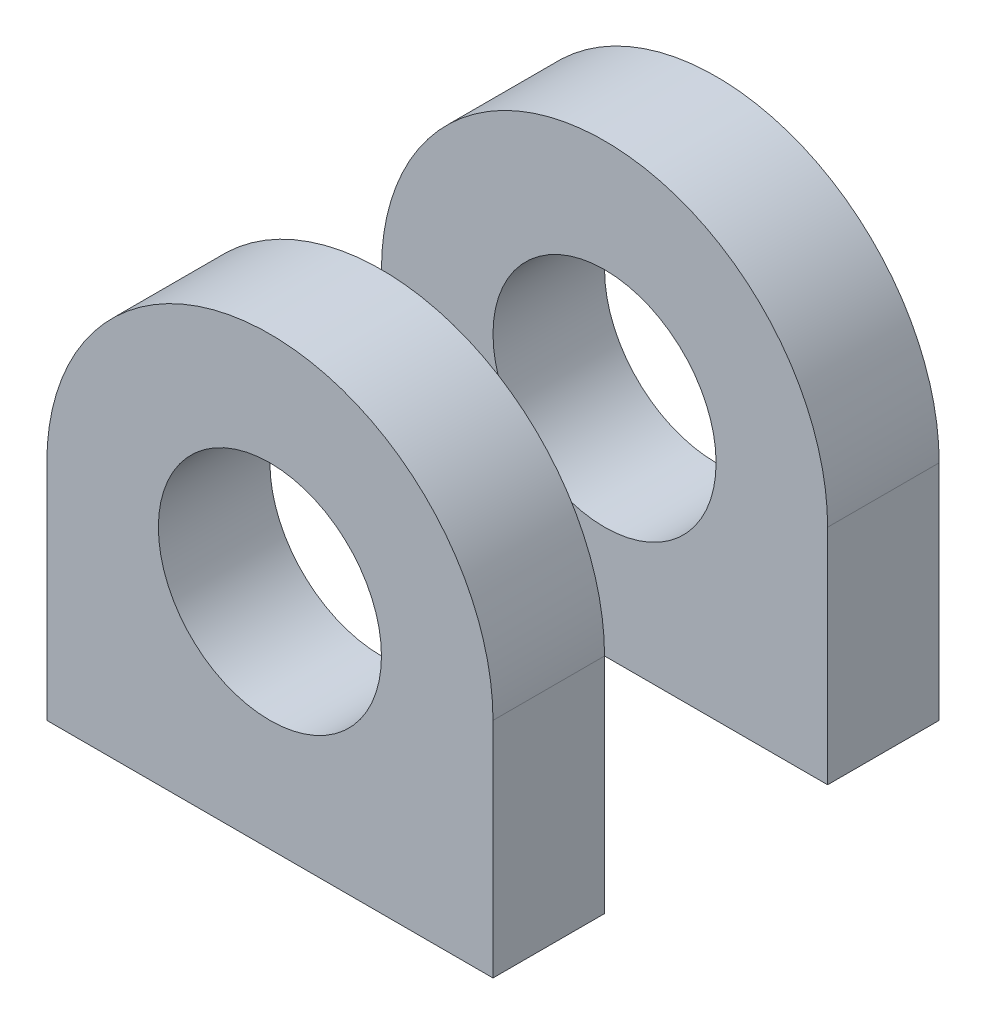
ISO-10303-21;
HEADER;
FILE_DESCRIPTION(('STEP AP214'),'2;1');
FILE_NAME('part.step','',(''),(''),'','','');
FILE_SCHEMA(('AUTOMOTIVE_DESIGN { 1 0 10303 214 1 1 1 1 }'));
ENDSEC;
DATA;
#1=APPLICATION_CONTEXT('core data for automotive mechanical design processes');
#2=APPLICATION_PROTOCOL_DEFINITION('international standard','automotive_design',2000,#1);
#3=PRODUCT_CONTEXT('',#1,'mechanical');
#4=PRODUCT('Part','Part','',(#3));
#5=PRODUCT_RELATED_PRODUCT_CATEGORY('part','',(#4));
#6=PRODUCT_DEFINITION_FORMATION('','',#4);
#7=PRODUCT_DEFINITION_CONTEXT('part definition',#1,'design');
#8=PRODUCT_DEFINITION('design','',#6,#7);
#9=PRODUCT_DEFINITION_SHAPE('','',#8);
#10=(LENGTH_UNIT() NAMED_UNIT(*) SI_UNIT(.MILLI.,.METRE.));
#11=(NAMED_UNIT(*) PLANE_ANGLE_UNIT() SI_UNIT($,.RADIAN.));
#12=(NAMED_UNIT(*) SI_UNIT($,.STERADIAN.) SOLID_ANGLE_UNIT());
#13=UNCERTAINTY_MEASURE_WITH_UNIT(LENGTH_MEASURE(1.E-05),#10,'distance_accuracy_value','');
#14=(GEOMETRIC_REPRESENTATION_CONTEXT(3) GLOBAL_UNCERTAINTY_ASSIGNED_CONTEXT((#13)) GLOBAL_UNIT_ASSIGNED_CONTEXT((#10,
#11,#12)) REPRESENTATION_CONTEXT('',''));
#15=CARTESIAN_POINT('',(0.,0.,0.));
#16=DIRECTION('',(0.,0.,1.));
#17=DIRECTION('',(1.,0.,0.));
#18=AXIS2_PLACEMENT_3D('',#15,#16,#17);
#19=CARTESIAN_POINT('',(100.,100.,100.));
#20=DIRECTION('',(-1.,0.,0.));
#21=DIRECTION('',(0.,0.,1.));
#22=AXIS2_PLACEMENT_3D('',#19,#20,#21);
#23=PLANE('',#22);
#24=DIRECTION('',(0.,0.,-1.));
#25=VECTOR('',#24,1.);
#26=CARTESIAN_POINT('',(100.,0.,100.));
#27=LINE('',#26,#25);
#28=CARTESIAN_POINT('',(100.,0.,100.));
#29=VERTEX_POINT('',#28);
#30=CARTESIAN_POINT('',(100.,0.,50.));
#31=VERTEX_POINT('',#30);
#32=EDGE_CURVE('E113',#29,#31,#27,.T.);
#33=ORIENTED_EDGE('',*,*,#32,.T.);
#34=DIRECTION('',(0.,-1.,0.));
#35=VECTOR('',#34,1.);
#36=CARTESIAN_POINT('',(100.,0.,50.));
#37=LINE('',#36,#35);
#38=CARTESIAN_POINT('',(100.,100.,50.));
#39=VERTEX_POINT('',#38);
#40=EDGE_CURVE('E12',#39,#31,#37,.T.);
#41=ORIENTED_EDGE('',*,*,#40,.F.);
#42=DIRECTION('',(0.,0.,-1.));
#43=VECTOR('',#42,1.);
#44=CARTESIAN_POINT('',(100.,100.,100.));
#45=LINE('',#44,#43);
#46=CARTESIAN_POINT('',(100.,100.,100.));
#47=VERTEX_POINT('',#46);
#48=EDGE_CURVE('E109',#47,#39,#45,.T.);
#49=ORIENTED_EDGE('',*,*,#48,.F.);
#50=DIRECTION('',(0.,-1.,0.));
#51=VECTOR('',#50,1.);
#52=CARTESIAN_POINT('',(100.,100.,100.));
#53=LINE('',#52,#51);
#54=EDGE_CURVE('E79',#47,#29,#53,.T.);
#55=ORIENTED_EDGE('',*,*,#54,.T.);
#56=EDGE_LOOP('',(#33,#41,#49,#55));
#57=FACE_BOUND('',#56,.T.);
#58=ADVANCED_FACE('F44',(#57),#23,.F.);
#59=CARTESIAN_POINT('',(-100.,100.,100.));
#60=DIRECTION('',(1.,0.,0.));
#61=DIRECTION('',(0.,0.,-1.));
#62=AXIS2_PLACEMENT_3D('',#59,#60,#61);
#63=PLANE('',#62);
#64=DIRECTION('',(0.,0.,1.));
#65=VECTOR('',#64,1.);
#66=CARTESIAN_POINT('',(-100.,100.,100.));
#67=LINE('',#66,#65);
#68=CARTESIAN_POINT('',(-100.,100.,50.));
#69=VERTEX_POINT('',#68);
#70=CARTESIAN_POINT('',(-100.,100.,100.));
#71=VERTEX_POINT('',#70);
#72=EDGE_CURVE('E94',#69,#71,#67,.T.);
#73=ORIENTED_EDGE('',*,*,#72,.F.);
#74=DIRECTION('',(0.,-1.,0.));
#75=VECTOR('',#74,1.);
#76=CARTESIAN_POINT('',(-100.,0.,50.));
#77=LINE('',#76,#75);
#78=CARTESIAN_POINT('',(-100.,0.,50.));
#79=VERTEX_POINT('',#78);
#80=EDGE_CURVE('E110',#69,#79,#77,.T.);
#81=ORIENTED_EDGE('',*,*,#80,.T.);
#82=DIRECTION('',(0.,0.,1.));
#83=VECTOR('',#82,1.);
#84=CARTESIAN_POINT('',(-100.,0.,100.));
#85=LINE('',#84,#83);
#86=CARTESIAN_POINT('',(-100.,0.,100.));
#87=VERTEX_POINT('',#86);
#88=EDGE_CURVE('E88',#79,#87,#85,.T.);
#89=ORIENTED_EDGE('',*,*,#88,.T.);
#90=DIRECTION('',(0.,-1.,0.));
#91=VECTOR('',#90,1.);
#92=CARTESIAN_POINT('',(-100.,100.,100.));
#93=LINE('',#92,#91);
#94=EDGE_CURVE('E53',#71,#87,#93,.T.);
#95=ORIENTED_EDGE('',*,*,#94,.F.);
#96=EDGE_LOOP('',(#73,#81,#89,#95));
#97=FACE_BOUND('',#96,.T.);
#98=ADVANCED_FACE('F100',(#97),#63,.F.);
#99=CARTESIAN_POINT('',(0.,0.,0.));
#100=DIRECTION('',(0.,-1.,0.));
#101=DIRECTION('',(0.,0.,-1.));
#102=AXIS2_PLACEMENT_3D('',#99,#100,#101);
#103=PLANE('',#102);
#104=DIRECTION('',(1.,0.,0.));
#105=VECTOR('',#104,1.);
#106=CARTESIAN_POINT('',(-100.,0.,50.));
#107=LINE('',#106,#105);
#108=EDGE_CURVE('E70',#79,#31,#107,.T.);
#109=ORIENTED_EDGE('',*,*,#108,.T.);
#110=ORIENTED_EDGE('',*,*,#32,.F.);
#111=DIRECTION('',(1.,0.,0.));
#112=VECTOR('',#111,1.);
#113=CARTESIAN_POINT('',(-100.,0.,100.));
#114=LINE('',#113,#112);
#115=EDGE_CURVE('E98',#87,#29,#114,.T.);
#116=ORIENTED_EDGE('',*,*,#115,.F.);
#117=ORIENTED_EDGE('',*,*,#88,.F.);
#118=EDGE_LOOP('',(#109,#110,#116,#117));
#119=FACE_BOUND('',#118,.T.);
#120=ADVANCED_FACE('F141',(#119),#103,.T.);
#121=CARTESIAN_POINT('',(0.,100.,100.));
#122=DIRECTION('',(0.,0.,-1.));
#123=DIRECTION('',(-1.,0.,0.));
#124=AXIS2_PLACEMENT_3D('',#121,#122,#123);
#125=CYLINDRICAL_SURFACE('',#124,100.);
#126=ORIENTED_EDGE('',*,*,#48,.T.);
#127=CARTESIAN_POINT('',(0.,100.,50.));
#128=DIRECTION('',(0.,0.,1.));
#129=DIRECTION('',(1.,0.,0.));
#130=AXIS2_PLACEMENT_3D('',#127,#128,#129);
#131=CIRCLE('',#130,100.);
#132=EDGE_CURVE('E61',#39,#69,#131,.T.);
#133=ORIENTED_EDGE('',*,*,#132,.T.);
#134=ORIENTED_EDGE('',*,*,#72,.T.);
#135=CARTESIAN_POINT('',(0.,100.,100.));
#136=DIRECTION('',(0.,0.,1.));
#137=DIRECTION('',(1.,0.,0.));
#138=AXIS2_PLACEMENT_3D('',#135,#136,#137);
#139=CIRCLE('',#138,100.);
#140=EDGE_CURVE('E97',#47,#71,#139,.T.);
#141=ORIENTED_EDGE('',*,*,#140,.F.);
#142=EDGE_LOOP('',(#126,#133,#134,#141));
#143=FACE_BOUND('',#142,.T.);
#144=ADVANCED_FACE('F96',(#143),#125,.T.);
#145=CARTESIAN_POINT('',(-100.,100.,100.));
#146=DIRECTION('',(0.,0.,-1.));
#147=DIRECTION('',(-1.,0.,0.));
#148=AXIS2_PLACEMENT_3D('',#145,#146,#147);
#149=PLANE('',#148);
#150=CARTESIAN_POINT('',(0.,100.,100.));
#151=DIRECTION('',(0.,0.,-1.));
#152=DIRECTION('',(-1.,0.,0.));
#153=AXIS2_PLACEMENT_3D('',#150,#151,#152);
#154=CIRCLE('',#153,50.);
#155=CARTESIAN_POINT('',(-50.,100.,100.));
#156=VERTEX_POINT('',#155);
#157=EDGE_CURVE('E118',#156,#156,#154,.T.);
#158=ORIENTED_EDGE('',*,*,#157,.T.);
#159=EDGE_LOOP('',(#158));
#160=FACE_BOUND('',#159,.T.);
#161=ORIENTED_EDGE('',*,*,#115,.T.);
#162=ORIENTED_EDGE('',*,*,#54,.F.);
#163=ORIENTED_EDGE('',*,*,#140,.T.);
#164=ORIENTED_EDGE('',*,*,#94,.T.);
#165=EDGE_LOOP('',(#161,#162,#163,#164));
#166=FACE_BOUND('',#165,.T.);
#167=ADVANCED_FACE('F103',(#160,#166),#149,.F.);
#168=CARTESIAN_POINT('',(-100.,0.,50.));
#169=DIRECTION('',(0.,0.,1.));
#170=DIRECTION('',(1.,0.,0.));
#171=AXIS2_PLACEMENT_3D('',#168,#169,#170);
#172=PLANE('',#171);
#173=CARTESIAN_POINT('',(0.,100.,50.));
#174=DIRECTION('',(0.,0.,1.));
#175=DIRECTION('',(1.,0.,0.));
#176=AXIS2_PLACEMENT_3D('',#173,#174,#175);
#177=CIRCLE('',#176,50.);
#178=CARTESIAN_POINT('',(50.,100.,50.));
#179=VERTEX_POINT('',#178);
#180=EDGE_CURVE('E47',#179,#179,#177,.T.);
#181=ORIENTED_EDGE('',*,*,#180,.T.);
#182=EDGE_LOOP('',(#181));
#183=FACE_BOUND('',#182,.T.);
#184=ORIENTED_EDGE('',*,*,#40,.T.);
#185=ORIENTED_EDGE('',*,*,#108,.F.);
#186=ORIENTED_EDGE('',*,*,#80,.F.);
#187=ORIENTED_EDGE('',*,*,#132,.F.);
#188=EDGE_LOOP('',(#184,#185,#186,#187));
#189=FACE_BOUND('',#188,.T.);
#190=ADVANCED_FACE('F130',(#183,#189),#172,.F.);
#191=CARTESIAN_POINT('',(0.,100.,100.));
#192=DIRECTION('',(0.,0.,-1.));
#193=DIRECTION('',(-1.,0.,0.));
#194=AXIS2_PLACEMENT_3D('',#191,#192,#193);
#195=CYLINDRICAL_SURFACE('',#194,50.);
#196=ORIENTED_EDGE('',*,*,#157,.F.);
#197=EDGE_LOOP('',(#196));
#198=FACE_BOUND('',#197,.T.);
#199=ORIENTED_EDGE('',*,*,#180,.F.);
#200=EDGE_LOOP('',(#199));
#201=FACE_BOUND('',#200,.T.);
#202=ADVANCED_FACE('F127',(#198,#201),#195,.F.);
#203=CLOSED_SHELL('',(#58,#98,#120,#144,#167,#190,#202));
#204=MANIFOLD_SOLID_BREP('B2',#203);
#205=CARTESIAN_POINT('',(-100.,100.,-100.));
#206=DIRECTION('',(0.,0.,1.));
#207=DIRECTION('',(1.,0.,0.));
#208=AXIS2_PLACEMENT_3D('',#205,#206,#207);
#209=PLANE('',#208);
#210=CARTESIAN_POINT('',(0.,100.,-100.));
#211=DIRECTION('',(0.,0.,1.));
#212=DIRECTION('',(1.,0.,0.));
#213=AXIS2_PLACEMENT_3D('',#210,#211,#212);
#214=CIRCLE('',#213,50.);
#215=CARTESIAN_POINT('',(50.,100.,-100.));
#216=VERTEX_POINT('',#215);
#217=EDGE_CURVE('E249',#216,#216,#214,.T.);
#218=ORIENTED_EDGE('',*,*,#217,.T.);
#219=EDGE_LOOP('',(#218));
#220=FACE_BOUND('',#219,.T.);
#221=DIRECTION('',(-1.,0.,0.));
#222=VECTOR('',#221,1.);
#223=CARTESIAN_POINT('',(-100.,0.,-100.));
#224=LINE('',#223,#222);
#225=CARTESIAN_POINT('',(100.,0.,-100.));
#226=VERTEX_POINT('',#225);
#227=CARTESIAN_POINT('',(-100.,0.,-100.));
#228=VERTEX_POINT('',#227);
#229=EDGE_CURVE('E252',#226,#228,#224,.T.);
#230=ORIENTED_EDGE('',*,*,#229,.T.);
#231=DIRECTION('',(0.,-1.,0.));
#232=VECTOR('',#231,1.);
#233=CARTESIAN_POINT('',(-100.,100.,-100.));
#234=LINE('',#233,#232);
#235=CARTESIAN_POINT('',(-100.,100.,-100.));
#236=VERTEX_POINT('',#235);
#237=EDGE_CURVE('E262',#236,#228,#234,.T.);
#238=ORIENTED_EDGE('',*,*,#237,.F.);
#239=CARTESIAN_POINT('',(0.,100.,-100.));
#240=DIRECTION('',(0.,0.,1.));
#241=DIRECTION('',(1.,0.,0.));
#242=AXIS2_PLACEMENT_3D('',#239,#240,#241);
#243=CIRCLE('',#242,100.);
#244=CARTESIAN_POINT('',(100.,100.,-100.));
#245=VERTEX_POINT('',#244);
#246=EDGE_CURVE('E247',#245,#236,#243,.T.);
#247=ORIENTED_EDGE('',*,*,#246,.F.);
#248=DIRECTION('',(0.,-1.,0.));
#249=VECTOR('',#248,1.);
#250=CARTESIAN_POINT('',(100.,100.,-100.));
#251=LINE('',#250,#249);
#252=EDGE_CURVE('E200',#245,#226,#251,.T.);
#253=ORIENTED_EDGE('',*,*,#252,.T.);
#254=EDGE_LOOP('',(#230,#238,#247,#253));
#255=FACE_BOUND('',#254,.T.);
#256=ADVANCED_FACE('F191',(#220,#255),#209,.F.);
#257=CARTESIAN_POINT('',(0.,100.,100.));
#258=DIRECTION('',(0.,0.,-1.));
#259=DIRECTION('',(-1.,0.,0.));
#260=AXIS2_PLACEMENT_3D('',#257,#258,#259);
#261=CYLINDRICAL_SURFACE('',#260,100.);
#262=DIRECTION('',(0.,0.,1.));
#263=VECTOR('',#262,1.);
#264=CARTESIAN_POINT('',(-100.,100.,100.));
#265=LINE('',#264,#263);
#266=CARTESIAN_POINT('',(-100.,100.,-50.));
#267=VERTEX_POINT('',#266);
#268=EDGE_CURVE('E233',#236,#267,#265,.T.);
#269=ORIENTED_EDGE('',*,*,#268,.T.);
#270=CARTESIAN_POINT('',(0.,100.,-50.));
#271=DIRECTION('',(0.,0.,-1.));
#272=DIRECTION('',(-1.,0.,0.));
#273=AXIS2_PLACEMENT_3D('',#270,#271,#272);
#274=CIRCLE('',#273,100.);
#275=CARTESIAN_POINT('',(100.,100.,-50.));
#276=VERTEX_POINT('',#275);
#277=EDGE_CURVE('E42',#267,#276,#274,.T.);
#278=ORIENTED_EDGE('',*,*,#277,.T.);
#279=DIRECTION('',(0.,0.,-1.));
#280=VECTOR('',#279,1.);
#281=CARTESIAN_POINT('',(100.,100.,100.));
#282=LINE('',#281,#280);
#283=EDGE_CURVE('E214',#276,#245,#282,.T.);
#284=ORIENTED_EDGE('',*,*,#283,.T.);
#285=ORIENTED_EDGE('',*,*,#246,.T.);
#286=EDGE_LOOP('',(#269,#278,#284,#285));
#287=FACE_BOUND('',#286,.T.);
#288=ADVANCED_FACE('F266',(#287),#261,.T.);
#289=CARTESIAN_POINT('',(0.,0.,0.));
#290=DIRECTION('',(0.,-1.,0.));
#291=DIRECTION('',(0.,0.,-1.));
#292=AXIS2_PLACEMENT_3D('',#289,#290,#291);
#293=PLANE('',#292);
#294=DIRECTION('',(1.,0.,0.));
#295=VECTOR('',#294,1.);
#296=CARTESIAN_POINT('',(-100.,0.,-50.));
#297=LINE('',#296,#295);
#298=CARTESIAN_POINT('',(-100.,0.,-50.));
#299=VERTEX_POINT('',#298);
#300=CARTESIAN_POINT('',(100.,0.,-50.));
#301=VERTEX_POINT('',#300);
#302=EDGE_CURVE('E241',#299,#301,#297,.T.);
#303=ORIENTED_EDGE('',*,*,#302,.F.);
#304=DIRECTION('',(0.,0.,1.));
#305=VECTOR('',#304,1.);
#306=CARTESIAN_POINT('',(-100.,0.,100.));
#307=LINE('',#306,#305);
#308=EDGE_CURVE('E255',#228,#299,#307,.T.);
#309=ORIENTED_EDGE('',*,*,#308,.F.);
#310=ORIENTED_EDGE('',*,*,#229,.F.);
#311=DIRECTION('',(0.,0.,-1.));
#312=VECTOR('',#311,1.);
#313=CARTESIAN_POINT('',(100.,0.,100.));
#314=LINE('',#313,#312);
#315=EDGE_CURVE('E225',#301,#226,#314,.T.);
#316=ORIENTED_EDGE('',*,*,#315,.F.);
#317=EDGE_LOOP('',(#303,#309,#310,#316));
#318=FACE_BOUND('',#317,.T.);
#319=ADVANCED_FACE('F251',(#318),#293,.T.);
#320=CARTESIAN_POINT('',(-100.,100.,100.));
#321=DIRECTION('',(1.,0.,0.));
#322=DIRECTION('',(0.,0.,-1.));
#323=AXIS2_PLACEMENT_3D('',#320,#321,#322);
#324=PLANE('',#323);
#325=ORIENTED_EDGE('',*,*,#308,.T.);
#326=DIRECTION('',(0.,1.,0.));
#327=VECTOR('',#326,1.);
#328=CARTESIAN_POINT('',(-100.,0.,-50.));
#329=LINE('',#328,#327);
#330=EDGE_CURVE('E243',#299,#267,#329,.T.);
#331=ORIENTED_EDGE('',*,*,#330,.T.);
#332=ORIENTED_EDGE('',*,*,#268,.F.);
#333=ORIENTED_EDGE('',*,*,#237,.T.);
#334=EDGE_LOOP('',(#325,#331,#332,#333));
#335=FACE_BOUND('',#334,.T.);
#336=ADVANCED_FACE('F290',(#335),#324,.F.);
#337=CARTESIAN_POINT('',(100.,100.,100.));
#338=DIRECTION('',(-1.,0.,0.));
#339=DIRECTION('',(0.,0.,1.));
#340=AXIS2_PLACEMENT_3D('',#337,#338,#339);
#341=PLANE('',#340);
#342=ORIENTED_EDGE('',*,*,#283,.F.);
#343=DIRECTION('',(0.,1.,0.));
#344=VECTOR('',#343,1.);
#345=CARTESIAN_POINT('',(100.,0.,-50.));
#346=LINE('',#345,#344);
#347=EDGE_CURVE('E207',#301,#276,#346,.T.);
#348=ORIENTED_EDGE('',*,*,#347,.F.);
#349=ORIENTED_EDGE('',*,*,#315,.T.);
#350=ORIENTED_EDGE('',*,*,#252,.F.);
#351=EDGE_LOOP('',(#342,#348,#349,#350));
#352=FACE_BOUND('',#351,.T.);
#353=ADVANCED_FACE('F193',(#352),#341,.F.);
#354=CARTESIAN_POINT('',(-100.,0.,-50.));
#355=DIRECTION('',(0.,0.,-1.));
#356=DIRECTION('',(-1.,0.,0.));
#357=AXIS2_PLACEMENT_3D('',#354,#355,#356);
#358=PLANE('',#357);
#359=CARTESIAN_POINT('',(0.,100.,-50.));
#360=DIRECTION('',(0.,0.,-1.));
#361=DIRECTION('',(-1.,0.,0.));
#362=AXIS2_PLACEMENT_3D('',#359,#360,#361);
#363=CIRCLE('',#362,50.);
#364=CARTESIAN_POINT('',(-50.,100.,-50.));
#365=VERTEX_POINT('',#364);
#366=EDGE_CURVE('E195',#365,#365,#363,.T.);
#367=ORIENTED_EDGE('',*,*,#366,.T.);
#368=EDGE_LOOP('',(#367));
#369=FACE_BOUND('',#368,.T.);
#370=ORIENTED_EDGE('',*,*,#330,.F.);
#371=ORIENTED_EDGE('',*,*,#302,.T.);
#372=ORIENTED_EDGE('',*,*,#347,.T.);
#373=ORIENTED_EDGE('',*,*,#277,.F.);
#374=EDGE_LOOP('',(#370,#371,#372,#373));
#375=FACE_BOUND('',#374,.T.);
#376=ADVANCED_FACE('F242',(#369,#375),#358,.F.);
#377=CARTESIAN_POINT('',(0.,100.,100.));
#378=DIRECTION('',(0.,0.,-1.));
#379=DIRECTION('',(-1.,0.,0.));
#380=AXIS2_PLACEMENT_3D('',#377,#378,#379);
#381=CYLINDRICAL_SURFACE('',#380,50.);
#382=ORIENTED_EDGE('',*,*,#366,.F.);
#383=EDGE_LOOP('',(#382));
#384=FACE_BOUND('',#383,.T.);
#385=ORIENTED_EDGE('',*,*,#217,.F.);
#386=EDGE_LOOP('',(#385));
#387=FACE_BOUND('',#386,.T.);
#388=ADVANCED_FACE('F276',(#384,#387),#381,.F.);
#389=CLOSED_SHELL('',(#256,#288,#319,#336,#353,#376,#388));
#390=MANIFOLD_SOLID_BREP('B6',#389);
#391=ADVANCED_BREP_SHAPE_REPRESENTATION('',(#18,#204,#390),#14);
#392=SHAPE_DEFINITION_REPRESENTATION(#9,#391);
ENDSEC;
END-ISO-10303-21;
